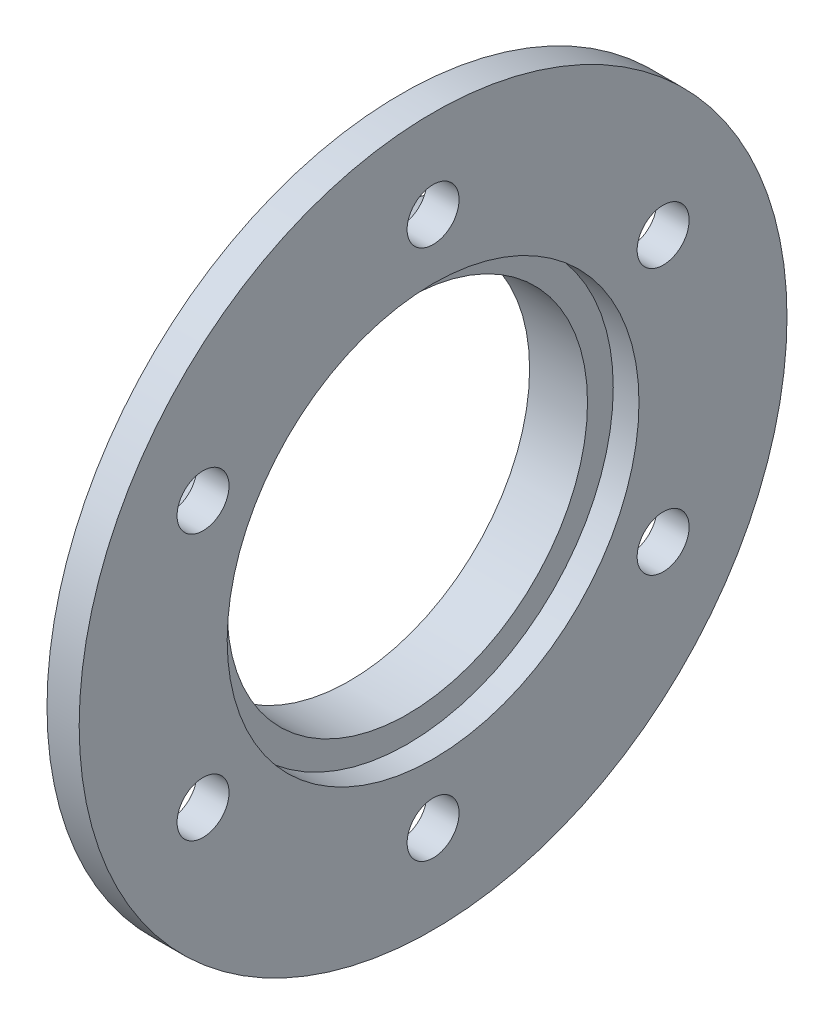
ISO-10303-21;
HEADER;
FILE_DESCRIPTION(('STEP AP214'),'2;1');
FILE_NAME('part.step','',(''),(''),'','','');
FILE_SCHEMA(('AUTOMOTIVE_DESIGN { 1 0 10303 214 1 1 1 1 }'));
ENDSEC;
DATA;
#1=APPLICATION_CONTEXT('core data for automotive mechanical design processes');
#2=APPLICATION_PROTOCOL_DEFINITION('international standard','automotive_design',2000,#1);
#3=PRODUCT_CONTEXT('',#1,'mechanical');
#4=PRODUCT('Part','Part','',(#3));
#5=PRODUCT_RELATED_PRODUCT_CATEGORY('part','',(#4));
#6=PRODUCT_DEFINITION_FORMATION('','',#4);
#7=PRODUCT_DEFINITION_CONTEXT('part definition',#1,'design');
#8=PRODUCT_DEFINITION('design','',#6,#7);
#9=PRODUCT_DEFINITION_SHAPE('','',#8);
#10=(LENGTH_UNIT() NAMED_UNIT(*) SI_UNIT(.MILLI.,.METRE.));
#11=(NAMED_UNIT(*) PLANE_ANGLE_UNIT() SI_UNIT($,.RADIAN.));
#12=(NAMED_UNIT(*) SI_UNIT($,.STERADIAN.) SOLID_ANGLE_UNIT());
#13=UNCERTAINTY_MEASURE_WITH_UNIT(LENGTH_MEASURE(1.E-05),#10,'distance_accuracy_value','');
#14=(GEOMETRIC_REPRESENTATION_CONTEXT(3) GLOBAL_UNCERTAINTY_ASSIGNED_CONTEXT((#13)) GLOBAL_UNIT_ASSIGNED_CONTEXT((#10,
#11,#12)) REPRESENTATION_CONTEXT('',''));
#15=CARTESIAN_POINT('',(0.,0.,0.));
#16=DIRECTION('',(0.,0.,1.));
#17=DIRECTION('',(1.,0.,0.));
#18=AXIS2_PLACEMENT_3D('',#15,#16,#17);
#19=CARTESIAN_POINT('',(6.,0.,0.));
#20=DIRECTION('',(-1.,0.,0.));
#21=DIRECTION('',(0.,0.,1.));
#22=AXIS2_PLACEMENT_3D('',#19,#20,#21);
#23=CYLINDRICAL_SURFACE('',#22,14.);
#24=CARTESIAN_POINT('',(-4.,0.,0.));
#25=DIRECTION('',(1.,0.,0.));
#26=DIRECTION('',(0.,0.,-1.));
#27=AXIS2_PLACEMENT_3D('',#24,#25,#26);
#28=CIRCLE('',#27,14.);
#29=CARTESIAN_POINT('',(-4.,0.,-14.));
#30=VERTEX_POINT('',#29);
#31=EDGE_CURVE('E119',#30,#30,#28,.T.);
#32=ORIENTED_EDGE('',*,*,#31,.F.);
#33=EDGE_LOOP('',(#32));
#34=FACE_BOUND('',#33,.T.);
#35=CARTESIAN_POINT('',(0.5,0.,0.));
#36=DIRECTION('',(1.,0.,0.));
#37=DIRECTION('',(0.,0.,-1.));
#38=AXIS2_PLACEMENT_3D('',#35,#36,#37);
#39=CIRCLE('',#38,14.);
#40=CARTESIAN_POINT('',(0.5,0.,-14.));
#41=VERTEX_POINT('',#40);
#42=EDGE_CURVE('E50',#41,#41,#39,.T.);
#43=ORIENTED_EDGE('',*,*,#42,.T.);
#44=EDGE_LOOP('',(#43));
#45=FACE_BOUND('',#44,.T.);
#46=ADVANCED_FACE('F45',(#34,#45),#23,.F.);
#47=CARTESIAN_POINT('',(2.5,0.,0.));
#48=DIRECTION('',(1.,0.,0.));
#49=DIRECTION('',(0.,0.,-1.));
#50=AXIS2_PLACEMENT_3D('',#47,#48,#49);
#51=PLANE('',#50);
#52=CARTESIAN_POINT('',(2.5,0.,0.));
#53=DIRECTION('',(1.,0.,0.));
#54=DIRECTION('',(0.,0.,-1.));
#55=AXIS2_PLACEMENT_3D('',#52,#53,#54);
#56=CIRCLE('',#55,16.);
#57=CARTESIAN_POINT('',(2.5,0.,-16.));
#58=VERTEX_POINT('',#57);
#59=EDGE_CURVE('E126',#58,#58,#56,.T.);
#60=ORIENTED_EDGE('',*,*,#59,.F.);
#61=EDGE_LOOP('',(#60));
#62=FACE_BOUND('',#61,.T.);
#63=CARTESIAN_POINT('',(2.5,-10.3199999999998,17.8747643341109));
#64=DIRECTION('',(1.,0.,0.));
#65=DIRECTION('',(0.,0.,-1.));
#66=AXIS2_PLACEMENT_3D('',#63,#64,#65);
#67=CIRCLE('',#66,2.01929999999999);
#68=CARTESIAN_POINT('',(2.5,-10.3199999999998,15.8554643341109));
#69=VERTEX_POINT('',#68);
#70=EDGE_CURVE('E103',#69,#69,#67,.T.);
#71=ORIENTED_EDGE('',*,*,#70,.F.);
#72=EDGE_LOOP('',(#71));
#73=FACE_BOUND('',#72,.T.);
#74=CARTESIAN_POINT('',(2.5,-10.3200000000001,-17.8747643341108));
#75=DIRECTION('',(1.,0.,0.));
#76=DIRECTION('',(0.,0.,-1.));
#77=AXIS2_PLACEMENT_3D('',#74,#75,#76);
#78=CIRCLE('',#77,2.01929999999999);
#79=CARTESIAN_POINT('',(2.5,-10.3200000000001,-19.8940643341108));
#80=VERTEX_POINT('',#79);
#81=EDGE_CURVE('E87',#80,#80,#78,.T.);
#82=ORIENTED_EDGE('',*,*,#81,.F.);
#83=EDGE_LOOP('',(#82));
#84=FACE_BOUND('',#83,.T.);
#85=CARTESIAN_POINT('',(2.5,20.64,0.));
#86=DIRECTION('',(1.,0.,0.));
#87=DIRECTION('',(0.,0.,-1.));
#88=AXIS2_PLACEMENT_3D('',#85,#86,#87);
#89=CIRCLE('',#88,2.01929999999999);
#90=CARTESIAN_POINT('',(2.5,20.64,-2.01929999999999));
#91=VERTEX_POINT('',#90);
#92=EDGE_CURVE('E71',#91,#91,#89,.T.);
#93=ORIENTED_EDGE('',*,*,#92,.F.);
#94=EDGE_LOOP('',(#93));
#95=FACE_BOUND('',#94,.T.);
#96=CARTESIAN_POINT('',(2.5,0.,0.));
#97=DIRECTION('',(1.,0.,0.));
#98=DIRECTION('',(0.,0.,-1.));
#99=AXIS2_PLACEMENT_3D('',#96,#97,#98);
#100=CIRCLE('',#99,27.5);
#101=CARTESIAN_POINT('',(2.5,0.,-27.5));
#102=VERTEX_POINT('',#101);
#103=EDGE_CURVE('E66',#102,#102,#100,.T.);
#104=ORIENTED_EDGE('',*,*,#103,.T.);
#105=EDGE_LOOP('',(#104));
#106=FACE_BOUND('',#105,.T.);
#107=CARTESIAN_POINT('',(2.5,10.32,-17.8747643341108));
#108=DIRECTION('',(1.,0.,0.));
#109=DIRECTION('',(0.,0.,-1.));
#110=AXIS2_PLACEMENT_3D('',#107,#108,#109);
#111=CIRCLE('',#110,2.01929999999999);
#112=CARTESIAN_POINT('',(2.5,10.32,-19.8940643341108));
#113=VERTEX_POINT('',#112);
#114=EDGE_CURVE('E79',#113,#113,#111,.T.);
#115=ORIENTED_EDGE('',*,*,#114,.F.);
#116=EDGE_LOOP('',(#115));
#117=FACE_BOUND('',#116,.T.);
#118=CARTESIAN_POINT('',(2.5,-20.64,1.44128349667445E-13));
#119=DIRECTION('',(1.,0.,0.));
#120=DIRECTION('',(0.,0.,-1.));
#121=AXIS2_PLACEMENT_3D('',#118,#119,#120);
#122=CIRCLE('',#121,2.01929999999999);
#123=CARTESIAN_POINT('',(2.5,-20.64,-2.01929999999985));
#124=VERTEX_POINT('',#123);
#125=EDGE_CURVE('E95',#124,#124,#122,.T.);
#126=ORIENTED_EDGE('',*,*,#125,.F.);
#127=EDGE_LOOP('',(#126));
#128=FACE_BOUND('',#127,.T.);
#129=CARTESIAN_POINT('',(2.5,10.3200000000002,17.8747643341107));
#130=DIRECTION('',(1.,0.,0.));
#131=DIRECTION('',(0.,0.,-1.));
#132=AXIS2_PLACEMENT_3D('',#129,#130,#131);
#133=CIRCLE('',#132,2.01929999999999);
#134=CARTESIAN_POINT('',(2.5,10.3200000000002,15.8554643341107));
#135=VERTEX_POINT('',#134);
#136=EDGE_CURVE('E111',#135,#135,#133,.T.);
#137=ORIENTED_EDGE('',*,*,#136,.F.);
#138=EDGE_LOOP('',(#137));
#139=FACE_BOUND('',#138,.T.);
#140=ADVANCED_FACE('F150',(#62,#73,#84,#95,#106,#117,#128,#139),#51,.T.);
#141=CARTESIAN_POINT('',(0.,0.,0.));
#142=DIRECTION('',(1.,0.,0.));
#143=DIRECTION('',(0.,0.,-1.));
#144=AXIS2_PLACEMENT_3D('',#141,#142,#143);
#145=PLANE('',#144);
#146=CARTESIAN_POINT('',(0.,0.,0.));
#147=DIRECTION('',(1.,0.,0.));
#148=DIRECTION('',(0.,0.,-1.));
#149=AXIS2_PLACEMENT_3D('',#146,#147,#148);
#150=CIRCLE('',#149,17.46);
#151=CARTESIAN_POINT('',(0.,0.,-17.46));
#152=VERTEX_POINT('',#151);
#153=EDGE_CURVE('E60',#152,#152,#150,.F.);
#154=ORIENTED_EDGE('',*,*,#153,.F.);
#155=EDGE_LOOP('',(#154));
#156=FACE_BOUND('',#155,.T.);
#157=CARTESIAN_POINT('',(0.,0.,0.));
#158=DIRECTION('',(1.,0.,0.));
#159=DIRECTION('',(0.,0.,-1.));
#160=AXIS2_PLACEMENT_3D('',#157,#158,#159);
#161=CIRCLE('',#160,27.5);
#162=CARTESIAN_POINT('',(0.,0.,-27.5));
#163=VERTEX_POINT('',#162);
#164=EDGE_CURVE('E67',#163,#163,#161,.T.);
#165=ORIENTED_EDGE('',*,*,#164,.F.);
#166=EDGE_LOOP('',(#165));
#167=FACE_BOUND('',#166,.T.);
#168=CARTESIAN_POINT('',(0.,20.64,0.));
#169=DIRECTION('',(1.,0.,0.));
#170=DIRECTION('',(0.,0.,-1.));
#171=AXIS2_PLACEMENT_3D('',#168,#169,#170);
#172=CIRCLE('',#171,2.01929999999999);
#173=CARTESIAN_POINT('',(0.,20.64,-2.01929999999999));
#174=VERTEX_POINT('',#173);
#175=EDGE_CURVE('E75',#174,#174,#172,.T.);
#176=ORIENTED_EDGE('',*,*,#175,.T.);
#177=EDGE_LOOP('',(#176));
#178=FACE_BOUND('',#177,.T.);
#179=CARTESIAN_POINT('',(0.,10.32,-17.8747643341108));
#180=DIRECTION('',(1.,0.,0.));
#181=DIRECTION('',(0.,0.,-1.));
#182=AXIS2_PLACEMENT_3D('',#179,#180,#181);
#183=CIRCLE('',#182,2.01929999999999);
#184=CARTESIAN_POINT('',(0.,10.32,-19.8940643341108));
#185=VERTEX_POINT('',#184);
#186=EDGE_CURVE('E83',#185,#185,#183,.T.);
#187=ORIENTED_EDGE('',*,*,#186,.T.);
#188=EDGE_LOOP('',(#187));
#189=FACE_BOUND('',#188,.T.);
#190=CARTESIAN_POINT('',(0.,-10.3200000000001,-17.8747643341108));
#191=DIRECTION('',(1.,0.,0.));
#192=DIRECTION('',(0.,0.,-1.));
#193=AXIS2_PLACEMENT_3D('',#190,#191,#192);
#194=CIRCLE('',#193,2.01929999999999);
#195=CARTESIAN_POINT('',(0.,-10.3200000000001,-19.8940643341108));
#196=VERTEX_POINT('',#195);
#197=EDGE_CURVE('E91',#196,#196,#194,.T.);
#198=ORIENTED_EDGE('',*,*,#197,.T.);
#199=EDGE_LOOP('',(#198));
#200=FACE_BOUND('',#199,.T.);
#201=CARTESIAN_POINT('',(0.,-20.64,1.44128349667445E-13));
#202=DIRECTION('',(1.,0.,0.));
#203=DIRECTION('',(0.,0.,-1.));
#204=AXIS2_PLACEMENT_3D('',#201,#202,#203);
#205=CIRCLE('',#204,2.01929999999999);
#206=CARTESIAN_POINT('',(0.,-20.64,-2.01929999999985));
#207=VERTEX_POINT('',#206);
#208=EDGE_CURVE('E99',#207,#207,#205,.T.);
#209=ORIENTED_EDGE('',*,*,#208,.T.);
#210=EDGE_LOOP('',(#209));
#211=FACE_BOUND('',#210,.T.);
#212=CARTESIAN_POINT('',(0.,-10.3199999999998,17.8747643341109));
#213=DIRECTION('',(1.,0.,0.));
#214=DIRECTION('',(0.,0.,-1.));
#215=AXIS2_PLACEMENT_3D('',#212,#213,#214);
#216=CIRCLE('',#215,2.01929999999999);
#217=CARTESIAN_POINT('',(0.,-10.3199999999998,15.8554643341109));
#218=VERTEX_POINT('',#217);
#219=EDGE_CURVE('E107',#218,#218,#216,.T.);
#220=ORIENTED_EDGE('',*,*,#219,.T.);
#221=EDGE_LOOP('',(#220));
#222=FACE_BOUND('',#221,.T.);
#223=CARTESIAN_POINT('',(0.,10.3200000000002,17.8747643341107));
#224=DIRECTION('',(1.,0.,0.));
#225=DIRECTION('',(0.,0.,-1.));
#226=AXIS2_PLACEMENT_3D('',#223,#224,#225);
#227=CIRCLE('',#226,2.01929999999999);
#228=CARTESIAN_POINT('',(0.,10.3200000000002,15.8554643341107));
#229=VERTEX_POINT('',#228);
#230=EDGE_CURVE('E115',#229,#229,#227,.T.);
#231=ORIENTED_EDGE('',*,*,#230,.T.);
#232=EDGE_LOOP('',(#231));
#233=FACE_BOUND('',#232,.T.);
#234=ADVANCED_FACE('F157',(#156,#167,#178,#189,#200,#211,#222,#233),#145,.F.);
#235=CARTESIAN_POINT('',(2.5,0.,0.));
#236=DIRECTION('',(-1.,0.,0.));
#237=DIRECTION('',(0.,0.,1.));
#238=AXIS2_PLACEMENT_3D('',#235,#236,#237);
#239=CYLINDRICAL_SURFACE('',#238,27.5);
#240=ORIENTED_EDGE('',*,*,#103,.F.);
#241=EDGE_LOOP('',(#240));
#242=FACE_BOUND('',#241,.T.);
#243=ORIENTED_EDGE('',*,*,#164,.T.);
#244=EDGE_LOOP('',(#243));
#245=FACE_BOUND('',#244,.T.);
#246=ADVANCED_FACE('F190',(#242,#245),#239,.T.);
#247=CARTESIAN_POINT('',(2.5,20.64,0.));
#248=DIRECTION('',(-1.,0.,0.));
#249=DIRECTION('',(0.,0.,1.));
#250=AXIS2_PLACEMENT_3D('',#247,#248,#249);
#251=CYLINDRICAL_SURFACE('',#250,2.01929999999999);
#252=ORIENTED_EDGE('',*,*,#92,.T.);
#253=EDGE_LOOP('',(#252));
#254=FACE_BOUND('',#253,.T.);
#255=ORIENTED_EDGE('',*,*,#175,.F.);
#256=EDGE_LOOP('',(#255));
#257=FACE_BOUND('',#256,.T.);
#258=ADVANCED_FACE('F187',(#254,#257),#251,.F.);
#259=CARTESIAN_POINT('',(2.5,10.32,-17.8747643341108));
#260=DIRECTION('',(-1.,0.,0.));
#261=DIRECTION('',(0.,0.,1.));
#262=AXIS2_PLACEMENT_3D('',#259,#260,#261);
#263=CYLINDRICAL_SURFACE('',#262,2.01929999999999);
#264=ORIENTED_EDGE('',*,*,#114,.T.);
#265=EDGE_LOOP('',(#264));
#266=FACE_BOUND('',#265,.T.);
#267=ORIENTED_EDGE('',*,*,#186,.F.);
#268=EDGE_LOOP('',(#267));
#269=FACE_BOUND('',#268,.T.);
#270=ADVANCED_FACE('F183',(#266,#269),#263,.F.);
#271=CARTESIAN_POINT('',(2.5,-10.3200000000001,-17.8747643341108));
#272=DIRECTION('',(-1.,0.,0.));
#273=DIRECTION('',(0.,0.,1.));
#274=AXIS2_PLACEMENT_3D('',#271,#272,#273);
#275=CYLINDRICAL_SURFACE('',#274,2.01929999999999);
#276=ORIENTED_EDGE('',*,*,#81,.T.);
#277=EDGE_LOOP('',(#276));
#278=FACE_BOUND('',#277,.T.);
#279=ORIENTED_EDGE('',*,*,#197,.F.);
#280=EDGE_LOOP('',(#279));
#281=FACE_BOUND('',#280,.T.);
#282=ADVANCED_FACE('F179',(#278,#281),#275,.F.);
#283=CARTESIAN_POINT('',(2.5,-20.64,1.44128349667445E-13));
#284=DIRECTION('',(-1.,0.,0.));
#285=DIRECTION('',(0.,0.,1.));
#286=AXIS2_PLACEMENT_3D('',#283,#284,#285);
#287=CYLINDRICAL_SURFACE('',#286,2.01929999999999);
#288=ORIENTED_EDGE('',*,*,#125,.T.);
#289=EDGE_LOOP('',(#288));
#290=FACE_BOUND('',#289,.T.);
#291=ORIENTED_EDGE('',*,*,#208,.F.);
#292=EDGE_LOOP('',(#291));
#293=FACE_BOUND('',#292,.T.);
#294=ADVANCED_FACE('F175',(#290,#293),#287,.F.);
#295=CARTESIAN_POINT('',(2.5,-10.3199999999998,17.8747643341109));
#296=DIRECTION('',(-1.,0.,0.));
#297=DIRECTION('',(0.,0.,1.));
#298=AXIS2_PLACEMENT_3D('',#295,#296,#297);
#299=CYLINDRICAL_SURFACE('',#298,2.01929999999999);
#300=ORIENTED_EDGE('',*,*,#70,.T.);
#301=EDGE_LOOP('',(#300));
#302=FACE_BOUND('',#301,.T.);
#303=ORIENTED_EDGE('',*,*,#219,.F.);
#304=EDGE_LOOP('',(#303));
#305=FACE_BOUND('',#304,.T.);
#306=ADVANCED_FACE('F171',(#302,#305),#299,.F.);
#307=CARTESIAN_POINT('',(2.5,10.3200000000002,17.8747643341107));
#308=DIRECTION('',(-1.,0.,0.));
#309=DIRECTION('',(0.,0.,1.));
#310=AXIS2_PLACEMENT_3D('',#307,#308,#309);
#311=CYLINDRICAL_SURFACE('',#310,2.01929999999999);
#312=ORIENTED_EDGE('',*,*,#136,.T.);
#313=EDGE_LOOP('',(#312));
#314=FACE_BOUND('',#313,.T.);
#315=ORIENTED_EDGE('',*,*,#230,.F.);
#316=EDGE_LOOP('',(#315));
#317=FACE_BOUND('',#316,.T.);
#318=ADVANCED_FACE('F168',(#314,#317),#311,.F.);
#319=CARTESIAN_POINT('',(-4.,0.,0.));
#320=DIRECTION('',(1.,0.,0.));
#321=DIRECTION('',(0.,0.,-1.));
#322=AXIS2_PLACEMENT_3D('',#319,#320,#321);
#323=CYLINDRICAL_SURFACE('',#322,17.46);
#324=CARTESIAN_POINT('',(-3.00000000000001,0.,0.));
#325=DIRECTION('',(-1.,0.,0.));
#326=DIRECTION('',(0.,0.,1.));
#327=AXIS2_PLACEMENT_3D('',#324,#325,#326);
#328=CIRCLE('',#327,17.46);
#329=CARTESIAN_POINT('',(-3.00000000000001,0.,17.46));
#330=VERTEX_POINT('',#329);
#331=EDGE_CURVE('E10',#330,#330,#328,.F.);
#332=ORIENTED_EDGE('',*,*,#331,.T.);
#333=EDGE_LOOP('',(#332));
#334=FACE_BOUND('',#333,.T.);
#335=ORIENTED_EDGE('',*,*,#153,.T.);
#336=EDGE_LOOP('',(#335));
#337=FACE_BOUND('',#336,.T.);
#338=ADVANCED_FACE('F164',(#334,#337),#323,.T.);
#339=CARTESIAN_POINT('',(-4.,0.,0.));
#340=DIRECTION('',(-1.,0.,0.));
#341=DIRECTION('',(0.,0.,1.));
#342=AXIS2_PLACEMENT_3D('',#339,#340,#341);
#343=PLANE('',#342);
#344=ORIENTED_EDGE('',*,*,#31,.T.);
#345=EDGE_LOOP('',(#344));
#346=FACE_BOUND('',#345,.T.);
#347=CARTESIAN_POINT('',(-4.,0.,0.));
#348=DIRECTION('',(-1.,0.,0.));
#349=DIRECTION('',(0.,0.,1.));
#350=AXIS2_PLACEMENT_3D('',#347,#348,#349);
#351=CIRCLE('',#350,16.46);
#352=CARTESIAN_POINT('',(-4.,0.,16.46));
#353=VERTEX_POINT('',#352);
#354=EDGE_CURVE('E55',#353,#353,#351,.T.);
#355=ORIENTED_EDGE('',*,*,#354,.T.);
#356=EDGE_LOOP('',(#355));
#357=FACE_BOUND('',#356,.T.);
#358=ADVANCED_FACE('F162',(#346,#357),#343,.T.);
#359=CARTESIAN_POINT('',(-4.,0.,0.));
#360=DIRECTION('',(1.,0.,0.));
#361=DIRECTION('',(0.,0.,-1.));
#362=AXIS2_PLACEMENT_3D('',#359,#360,#361);
#363=CONICAL_SURFACE('',#362,16.46,0.785398163397447);
#364=ORIENTED_EDGE('',*,*,#331,.F.);
#365=EDGE_LOOP('',(#364));
#366=FACE_BOUND('',#365,.T.);
#367=ORIENTED_EDGE('',*,*,#354,.F.);
#368=EDGE_LOOP('',(#367));
#369=FACE_BOUND('',#368,.T.);
#370=ADVANCED_FACE('F48',(#366,#369),#363,.T.);
#371=CARTESIAN_POINT('',(0.5,0.,0.));
#372=DIRECTION('',(1.,0.,0.));
#373=DIRECTION('',(0.,0.,-1.));
#374=AXIS2_PLACEMENT_3D('',#371,#372,#373);
#375=CYLINDRICAL_SURFACE('',#374,16.);
#376=CARTESIAN_POINT('',(0.5,0.,0.));
#377=DIRECTION('',(1.,0.,0.));
#378=DIRECTION('',(0.,0.,-1.));
#379=AXIS2_PLACEMENT_3D('',#376,#377,#378);
#380=CIRCLE('',#379,16.);
#381=CARTESIAN_POINT('',(0.5,0.,-16.));
#382=VERTEX_POINT('',#381);
#383=EDGE_CURVE('E130',#382,#382,#380,.T.);
#384=ORIENTED_EDGE('',*,*,#383,.F.);
#385=EDGE_LOOP('',(#384));
#386=FACE_BOUND('',#385,.T.);
#387=ORIENTED_EDGE('',*,*,#59,.T.);
#388=EDGE_LOOP('',(#387));
#389=FACE_BOUND('',#388,.T.);
#390=ADVANCED_FACE('F142',(#386,#389),#375,.F.);
#391=CARTESIAN_POINT('',(0.5,0.,0.));
#392=DIRECTION('',(1.,0.,0.));
#393=DIRECTION('',(0.,0.,-1.));
#394=AXIS2_PLACEMENT_3D('',#391,#392,#393);
#395=PLANE('',#394);
#396=ORIENTED_EDGE('',*,*,#42,.F.);
#397=EDGE_LOOP('',(#396));
#398=FACE_BOUND('',#397,.T.);
#399=ORIENTED_EDGE('',*,*,#383,.T.);
#400=EDGE_LOOP('',(#399));
#401=FACE_BOUND('',#400,.T.);
#402=ADVANCED_FACE('F140',(#398,#401),#395,.T.);
#403=CLOSED_SHELL('',(#46,#140,#234,#246,#258,#270,#282,#294,#306,#318,#338,#358,#370,#390,#402));
#404=MANIFOLD_SOLID_BREP('B2',#403);
#405=ADVANCED_BREP_SHAPE_REPRESENTATION('',(#18,#404),#14);
#406=SHAPE_DEFINITION_REPRESENTATION(#9,#405);
ENDSEC;
END-ISO-10303-21;
